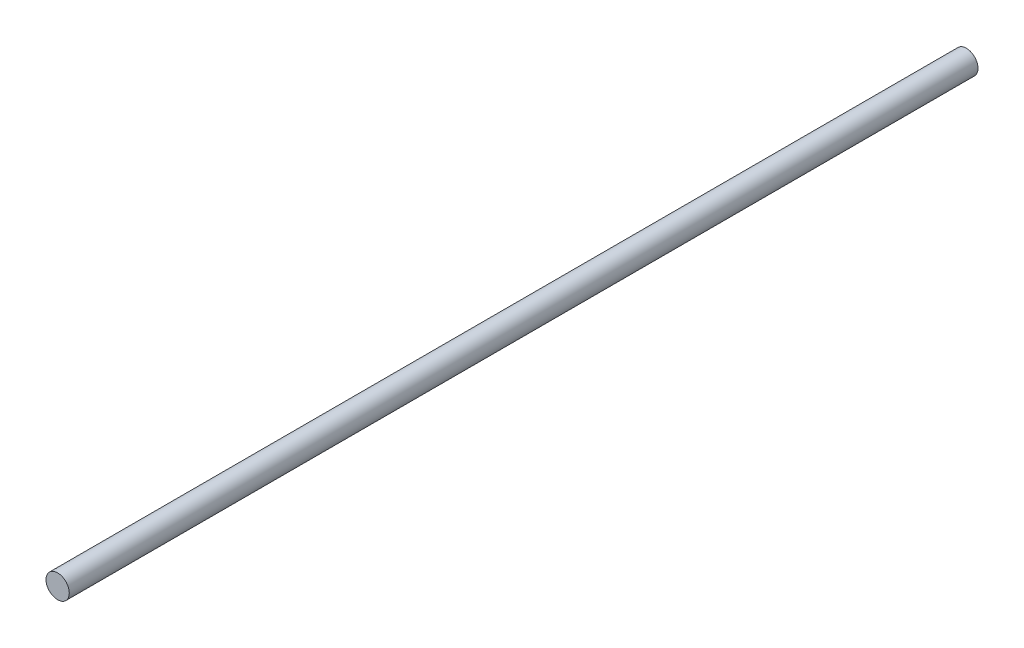
ISO-10303-21;
HEADER;
FILE_DESCRIPTION(('STEP AP214'),'2;1');
FILE_NAME('part.step','',(''),(''),'','','');
FILE_SCHEMA(('AUTOMOTIVE_DESIGN { 1 0 10303 214 1 1 1 1 }'));
ENDSEC;
DATA;
#1=APPLICATION_CONTEXT('core data for automotive mechanical design processes');
#2=APPLICATION_PROTOCOL_DEFINITION('international standard','automotive_design',2000,#1);
#3=PRODUCT_CONTEXT('',#1,'mechanical');
#4=PRODUCT('Part','Part','',(#3));
#5=PRODUCT_RELATED_PRODUCT_CATEGORY('part','',(#4));
#6=PRODUCT_DEFINITION_FORMATION('','',#4);
#7=PRODUCT_DEFINITION_CONTEXT('part definition',#1,'design');
#8=PRODUCT_DEFINITION('design','',#6,#7);
#9=PRODUCT_DEFINITION_SHAPE('','',#8);
#10=(LENGTH_UNIT() NAMED_UNIT(*) SI_UNIT(.MILLI.,.METRE.));
#11=(NAMED_UNIT(*) PLANE_ANGLE_UNIT() SI_UNIT($,.RADIAN.));
#12=(NAMED_UNIT(*) SI_UNIT($,.STERADIAN.) SOLID_ANGLE_UNIT());
#13=UNCERTAINTY_MEASURE_WITH_UNIT(LENGTH_MEASURE(1.E-05),#10,'distance_accuracy_value','');
#14=(GEOMETRIC_REPRESENTATION_CONTEXT(3) GLOBAL_UNCERTAINTY_ASSIGNED_CONTEXT((#13)) GLOBAL_UNIT_ASSIGNED_CONTEXT((#10,
#11,#12)) REPRESENTATION_CONTEXT('',''));
#15=CARTESIAN_POINT('',(0.,0.,0.));
#16=DIRECTION('',(0.,0.,1.));
#17=DIRECTION('',(1.,0.,0.));
#18=AXIS2_PLACEMENT_3D('',#15,#16,#17);
#19=CARTESIAN_POINT('',(-21.2024389130223,3.95852329038651,195.));
#20=DIRECTION('',(0.,0.,-1.));
#21=DIRECTION('',(-1.,0.,0.));
#22=AXIS2_PLACEMENT_3D('',#19,#20,#21);
#23=CYLINDRICAL_SURFACE('',#22,2.5);
#24=CARTESIAN_POINT('',(-21.2024389130223,3.95852329038651,195.));
#25=DIRECTION('',(0.,0.,1.));
#26=DIRECTION('',(1.,0.,0.));
#27=AXIS2_PLACEMENT_3D('',#24,#25,#26);
#28=CIRCLE('',#27,2.5);
#29=CARTESIAN_POINT('',(-18.7024389130223,3.95852329038651,195.));
#30=VERTEX_POINT('',#29);
#31=EDGE_CURVE('E10',#30,#30,#28,.T.);
#32=ORIENTED_EDGE('',*,*,#31,.F.);
#33=EDGE_LOOP('',(#32));
#34=FACE_BOUND('',#33,.T.);
#35=CARTESIAN_POINT('',(-21.2024389130223,3.95852329038651,0.));
#36=DIRECTION('',(0.,0.,1.));
#37=DIRECTION('',(1.,0.,0.));
#38=AXIS2_PLACEMENT_3D('',#35,#36,#37);
#39=CIRCLE('',#38,2.5);
#40=CARTESIAN_POINT('',(-18.7024389130223,3.95852329038651,0.));
#41=VERTEX_POINT('',#40);
#42=EDGE_CURVE('E35',#41,#41,#39,.T.);
#43=ORIENTED_EDGE('',*,*,#42,.T.);
#44=EDGE_LOOP('',(#43));
#45=FACE_BOUND('',#44,.T.);
#46=ADVANCED_FACE('F32',(#34,#45),#23,.T.);
#47=CARTESIAN_POINT('',(-21.2024389130223,3.95852329038651,195.));
#48=DIRECTION('',(0.,0.,1.));
#49=DIRECTION('',(1.,0.,0.));
#50=AXIS2_PLACEMENT_3D('',#47,#48,#49);
#51=PLANE('',#50);
#52=ORIENTED_EDGE('',*,*,#31,.T.);
#53=EDGE_LOOP('',(#52));
#54=FACE_BOUND('',#53,.T.);
#55=ADVANCED_FACE('F47',(#54),#51,.T.);
#56=CARTESIAN_POINT('',(-21.2024389130223,3.95852329038651,0.));
#57=DIRECTION('',(0.,0.,1.));
#58=DIRECTION('',(1.,0.,0.));
#59=AXIS2_PLACEMENT_3D('',#56,#57,#58);
#60=PLANE('',#59);
#61=ORIENTED_EDGE('',*,*,#42,.F.);
#62=EDGE_LOOP('',(#61));
#63=FACE_BOUND('',#62,.T.);
#64=ADVANCED_FACE('F45',(#63),#60,.F.);
#65=CLOSED_SHELL('',(#46,#55,#64));
#66=MANIFOLD_SOLID_BREP('B2',#65);
#67=ADVANCED_BREP_SHAPE_REPRESENTATION('',(#18,#66),#14);
#68=SHAPE_DEFINITION_REPRESENTATION(#9,#67);
ENDSEC;
END-ISO-10303-21;
